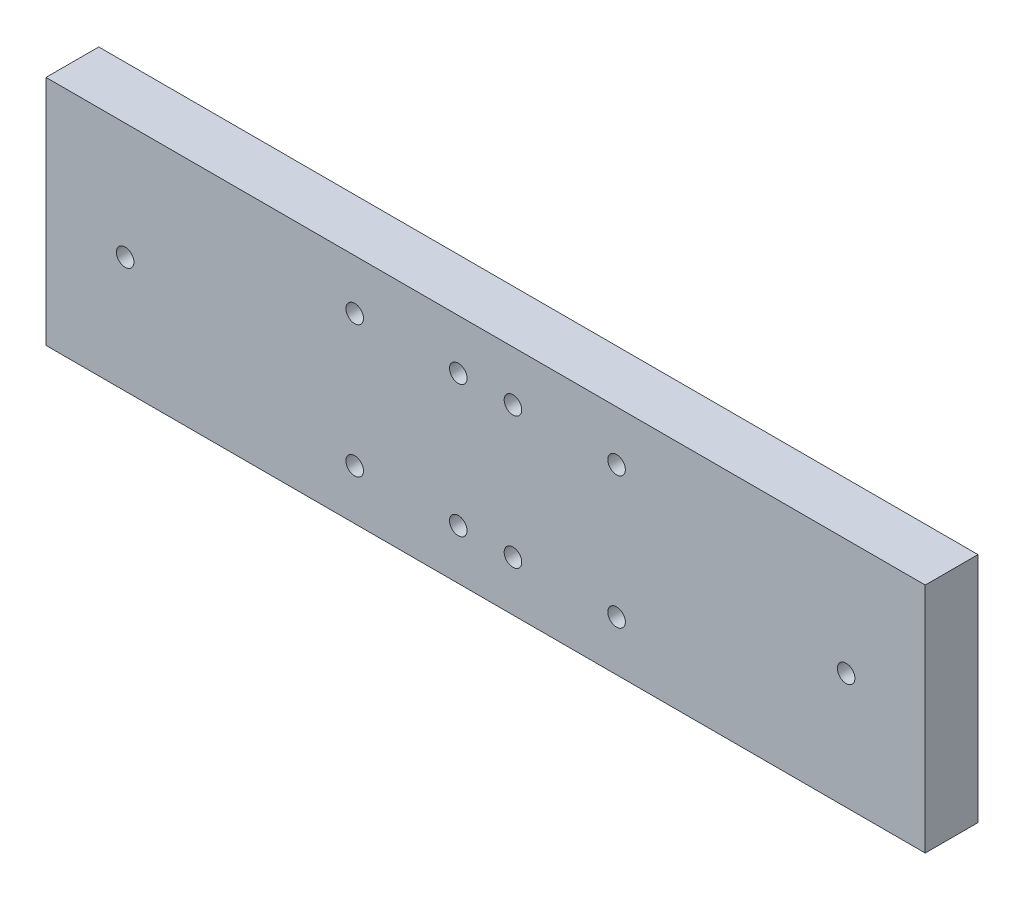
ISO-10303-21;
HEADER;
FILE_DESCRIPTION(('STEP AP214'),'2;1');
FILE_NAME('part.step','',(''),(''),'','','');
FILE_SCHEMA(('AUTOMOTIVE_DESIGN { 1 0 10303 214 1 1 1 1 }'));
ENDSEC;
DATA;
#1=APPLICATION_CONTEXT('core data for automotive mechanical design processes');
#2=APPLICATION_PROTOCOL_DEFINITION('international standard','automotive_design',2000,#1);
#3=PRODUCT_CONTEXT('',#1,'mechanical');
#4=PRODUCT('Part','Part','',(#3));
#5=PRODUCT_RELATED_PRODUCT_CATEGORY('part','',(#4));
#6=PRODUCT_DEFINITION_FORMATION('','',#4);
#7=PRODUCT_DEFINITION_CONTEXT('part definition',#1,'design');
#8=PRODUCT_DEFINITION('design','',#6,#7);
#9=PRODUCT_DEFINITION_SHAPE('','',#8);
#10=(LENGTH_UNIT() NAMED_UNIT(*) SI_UNIT(.MILLI.,.METRE.));
#11=(NAMED_UNIT(*) PLANE_ANGLE_UNIT() SI_UNIT($,.RADIAN.));
#12=(NAMED_UNIT(*) SI_UNIT($,.STERADIAN.) SOLID_ANGLE_UNIT());
#13=UNCERTAINTY_MEASURE_WITH_UNIT(LENGTH_MEASURE(1.E-05),#10,'distance_accuracy_value','');
#14=(GEOMETRIC_REPRESENTATION_CONTEXT(3) GLOBAL_UNCERTAINTY_ASSIGNED_CONTEXT((#13)) GLOBAL_UNIT_ASSIGNED_CONTEXT((#10,
#11,#12)) REPRESENTATION_CONTEXT('',''));
#15=CARTESIAN_POINT('',(0.,0.,0.));
#16=DIRECTION('',(0.,0.,1.));
#17=DIRECTION('',(1.,0.,0.));
#18=AXIS2_PLACEMENT_3D('',#15,#16,#17);
#19=CARTESIAN_POINT('',(0.,0.,15.));
#20=DIRECTION('',(0.,0.,-1.));
#21=DIRECTION('',(-1.,0.,0.));
#22=AXIS2_PLACEMENT_3D('',#19,#20,#21);
#23=PLANE('',#22);
#24=DIRECTION('',(0.,-1.,0.));
#25=VECTOR('',#24,1.);
#26=CARTESIAN_POINT('',(-147.500000000002,-5.74999999999681,15.));
#27=LINE('',#26,#25);
#28=CARTESIAN_POINT('',(-147.500000000002,-5.74999999999681,15.));
#29=VERTEX_POINT('',#28);
#30=CARTESIAN_POINT('',(-147.500000000002,-71.7499999999969,15.));
#31=VERTEX_POINT('',#30);
#32=EDGE_CURVE('E91',#29,#31,#27,.T.);
#33=ORIENTED_EDGE('',*,*,#32,.T.);
#34=DIRECTION('',(1.,0.,0.));
#35=VECTOR('',#34,1.);
#36=CARTESIAN_POINT('',(102.499999999998,-71.7499999999969,15.));
#37=LINE('',#36,#35);
#38=CARTESIAN_POINT('',(102.499999999998,-71.7499999999969,15.));
#39=VERTEX_POINT('',#38);
#40=EDGE_CURVE('E86',#31,#39,#37,.T.);
#41=ORIENTED_EDGE('',*,*,#40,.T.);
#42=DIRECTION('',(0.,1.,0.));
#43=VECTOR('',#42,1.);
#44=CARTESIAN_POINT('',(102.499999999998,-5.74999999999681,15.));
#45=LINE('',#44,#43);
#46=CARTESIAN_POINT('',(102.499999999998,-5.74999999999681,15.));
#47=VERTEX_POINT('',#46);
#48=EDGE_CURVE('E89',#39,#47,#45,.T.);
#49=ORIENTED_EDGE('',*,*,#48,.T.);
#50=DIRECTION('',(-1.,0.,0.));
#51=VECTOR('',#50,1.);
#52=CARTESIAN_POINT('',(102.499999999998,-5.74999999999681,15.));
#53=LINE('',#52,#51);
#54=EDGE_CURVE('E56',#47,#29,#53,.T.);
#55=ORIENTED_EDGE('',*,*,#54,.T.);
#56=EDGE_LOOP('',(#33,#41,#49,#55));
#57=FACE_BOUND('',#56,.T.);
#58=CARTESIAN_POINT('',(14.7286790709376,-19.9999999999967,15.));
#59=DIRECTION('',(0.,0.,1.));
#60=DIRECTION('',(1.,0.,0.));
#61=AXIS2_PLACEMENT_3D('',#58,#59,#60);
#62=CIRCLE('',#61,2.49999999999997);
#63=CARTESIAN_POINT('',(17.2286790709376,-19.9999999999967,15.));
#64=VERTEX_POINT('',#63);
#65=EDGE_CURVE('E106',#64,#64,#62,.T.);
#66=ORIENTED_EDGE('',*,*,#65,.F.);
#67=EDGE_LOOP('',(#66));
#68=FACE_BOUND('',#67,.T.);
#69=CARTESIAN_POINT('',(14.7286790709375,-57.4999999999968,15.));
#70=DIRECTION('',(0.,0.,1.));
#71=DIRECTION('',(1.,0.,0.));
#72=AXIS2_PLACEMENT_3D('',#69,#70,#71);
#73=CIRCLE('',#72,2.49999999999996);
#74=CARTESIAN_POINT('',(17.2286790709375,-57.4999999999968,15.));
#75=VERTEX_POINT('',#74);
#76=EDGE_CURVE('E121',#75,#75,#73,.T.);
#77=ORIENTED_EDGE('',*,*,#76,.F.);
#78=EDGE_LOOP('',(#77));
#79=FACE_BOUND('',#78,.T.);
#80=CARTESIAN_POINT('',(-14.728679070942,-57.4999999999966,15.));
#81=DIRECTION('',(0.,0.,1.));
#82=DIRECTION('',(1.,0.,0.));
#83=AXIS2_PLACEMENT_3D('',#80,#81,#82);
#84=CIRCLE('',#83,2.49999999999997);
#85=CARTESIAN_POINT('',(-12.228679070942,-57.4999999999966,15.));
#86=VERTEX_POINT('',#85);
#87=EDGE_CURVE('E127',#86,#86,#84,.T.);
#88=ORIENTED_EDGE('',*,*,#87,.F.);
#89=EDGE_LOOP('',(#88));
#90=FACE_BOUND('',#89,.T.);
#91=CARTESIAN_POINT('',(-14.7286790709419,-19.9999999999967,15.));
#92=DIRECTION('',(0.,0.,1.));
#93=DIRECTION('',(1.,0.,0.));
#94=AXIS2_PLACEMENT_3D('',#91,#92,#93);
#95=CIRCLE('',#94,2.49999999999997);
#96=CARTESIAN_POINT('',(-12.2286790709419,-19.9999999999967,15.));
#97=VERTEX_POINT('',#96);
#98=EDGE_CURVE('E133',#97,#97,#95,.T.);
#99=ORIENTED_EDGE('',*,*,#98,.F.);
#100=EDGE_LOOP('',(#99));
#101=FACE_BOUND('',#100,.T.);
#102=CARTESIAN_POINT('',(-30.2713209290622,-19.9999999999967,15.));
#103=DIRECTION('',(0.,0.,1.));
#104=DIRECTION('',(1.,0.,0.));
#105=AXIS2_PLACEMENT_3D('',#102,#103,#104);
#106=CIRCLE('',#105,2.49999999999997);
#107=CARTESIAN_POINT('',(-27.7713209290622,-19.9999999999967,15.));
#108=VERTEX_POINT('',#107);
#109=EDGE_CURVE('E139',#108,#108,#106,.T.);
#110=ORIENTED_EDGE('',*,*,#109,.F.);
#111=EDGE_LOOP('',(#110));
#112=FACE_BOUND('',#111,.T.);
#113=CARTESIAN_POINT('',(-30.2713209290623,-57.4999999999968,15.));
#114=DIRECTION('',(0.,0.,1.));
#115=DIRECTION('',(1.,0.,0.));
#116=AXIS2_PLACEMENT_3D('',#113,#114,#115);
#117=CIRCLE('',#116,2.49999999999997);
#118=CARTESIAN_POINT('',(-27.7713209290624,-57.4999999999968,15.));
#119=VERTEX_POINT('',#118);
#120=EDGE_CURVE('E145',#119,#119,#117,.T.);
#121=ORIENTED_EDGE('',*,*,#120,.F.);
#122=EDGE_LOOP('',(#121));
#123=FACE_BOUND('',#122,.T.);
#124=CARTESIAN_POINT('',(-59.7286790709419,-57.4999999999968,15.));
#125=DIRECTION('',(0.,0.,1.));
#126=DIRECTION('',(1.,0.,0.));
#127=AXIS2_PLACEMENT_3D('',#124,#125,#126);
#128=CIRCLE('',#127,2.49999999999997);
#129=CARTESIAN_POINT('',(-57.2286790709419,-57.4999999999968,15.));
#130=VERTEX_POINT('',#129);
#131=EDGE_CURVE('E151',#130,#130,#128,.T.);
#132=ORIENTED_EDGE('',*,*,#131,.F.);
#133=EDGE_LOOP('',(#132));
#134=FACE_BOUND('',#133,.T.);
#135=CARTESIAN_POINT('',(-59.7286790709417,-19.9999999999967,15.));
#136=DIRECTION('',(0.,0.,1.));
#137=DIRECTION('',(1.,0.,0.));
#138=AXIS2_PLACEMENT_3D('',#135,#136,#137);
#139=CIRCLE('',#138,2.49999999999997);
#140=CARTESIAN_POINT('',(-57.2286790709417,-19.9999999999967,15.));
#141=VERTEX_POINT('',#140);
#142=EDGE_CURVE('E157',#141,#141,#139,.T.);
#143=ORIENTED_EDGE('',*,*,#142,.F.);
#144=EDGE_LOOP('',(#143));
#145=FACE_BOUND('',#144,.T.);
#146=CARTESIAN_POINT('',(79.999999999998,-38.7499999999967,15.));
#147=DIRECTION('',(0.,0.,1.));
#148=DIRECTION('',(1.,0.,0.));
#149=AXIS2_PLACEMENT_3D('',#146,#147,#148);
#150=CIRCLE('',#149,2.50000000001049);
#151=CARTESIAN_POINT('',(82.5000000000085,-38.7499999999967,15.));
#152=VERTEX_POINT('',#151);
#153=EDGE_CURVE('E163',#152,#152,#150,.T.);
#154=ORIENTED_EDGE('',*,*,#153,.F.);
#155=EDGE_LOOP('',(#154));
#156=FACE_BOUND('',#155,.T.);
#157=CARTESIAN_POINT('',(-125.000000000002,-38.7499999999967,15.));
#158=DIRECTION('',(0.,0.,1.));
#159=DIRECTION('',(-1.,0.,0.));
#160=AXIS2_PLACEMENT_3D('',#157,#158,#159);
#161=CIRCLE('',#160,2.50000000001049);
#162=CARTESIAN_POINT('',(-127.500000000012,-38.7499999999967,15.));
#163=VERTEX_POINT('',#162);
#164=EDGE_CURVE('E169',#163,#163,#161,.T.);
#165=ORIENTED_EDGE('',*,*,#164,.F.);
#166=EDGE_LOOP('',(#165));
#167=FACE_BOUND('',#166,.T.);
#168=ADVANCED_FACE('F39',(#57,#68,#79,#90,#101,#112,#123,#134,#145,#156,#167),#23,.F.);
#169=CARTESIAN_POINT('',(0.,0.,0.));
#170=DIRECTION('',(0.,0.,-1.));
#171=DIRECTION('',(-1.,0.,0.));
#172=AXIS2_PLACEMENT_3D('',#169,#170,#171);
#173=PLANE('',#172);
#174=CARTESIAN_POINT('',(79.999999999998,-38.7499999999967,0.));
#175=DIRECTION('',(0.,0.,1.));
#176=DIRECTION('',(1.,0.,0.));
#177=AXIS2_PLACEMENT_3D('',#174,#175,#176);
#178=CIRCLE('',#177,2.50000000001049);
#179=CARTESIAN_POINT('',(82.5000000000085,-38.7499999999967,0.));
#180=VERTEX_POINT('',#179);
#181=EDGE_CURVE('E166',#180,#180,#178,.T.);
#182=ORIENTED_EDGE('',*,*,#181,.T.);
#183=EDGE_LOOP('',(#182));
#184=FACE_BOUND('',#183,.T.);
#185=CARTESIAN_POINT('',(-59.7286790709419,-57.4999999999968,0.));
#186=DIRECTION('',(0.,0.,1.));
#187=DIRECTION('',(1.,0.,0.));
#188=AXIS2_PLACEMENT_3D('',#185,#186,#187);
#189=CIRCLE('',#188,2.49999999999997);
#190=CARTESIAN_POINT('',(-57.2286790709419,-57.4999999999968,0.));
#191=VERTEX_POINT('',#190);
#192=EDGE_CURVE('E154',#191,#191,#189,.T.);
#193=ORIENTED_EDGE('',*,*,#192,.T.);
#194=EDGE_LOOP('',(#193));
#195=FACE_BOUND('',#194,.T.);
#196=CARTESIAN_POINT('',(-30.2713209290622,-19.9999999999967,0.));
#197=DIRECTION('',(0.,0.,1.));
#198=DIRECTION('',(1.,0.,0.));
#199=AXIS2_PLACEMENT_3D('',#196,#197,#198);
#200=CIRCLE('',#199,2.49999999999997);
#201=CARTESIAN_POINT('',(-27.7713209290622,-19.9999999999967,0.));
#202=VERTEX_POINT('',#201);
#203=EDGE_CURVE('E142',#202,#202,#200,.T.);
#204=ORIENTED_EDGE('',*,*,#203,.T.);
#205=EDGE_LOOP('',(#204));
#206=FACE_BOUND('',#205,.T.);
#207=CARTESIAN_POINT('',(-14.728679070942,-57.4999999999966,0.));
#208=DIRECTION('',(0.,0.,1.));
#209=DIRECTION('',(1.,0.,0.));
#210=AXIS2_PLACEMENT_3D('',#207,#208,#209);
#211=CIRCLE('',#210,2.49999999999997);
#212=CARTESIAN_POINT('',(-12.228679070942,-57.4999999999966,0.));
#213=VERTEX_POINT('',#212);
#214=EDGE_CURVE('E130',#213,#213,#211,.T.);
#215=ORIENTED_EDGE('',*,*,#214,.T.);
#216=EDGE_LOOP('',(#215));
#217=FACE_BOUND('',#216,.T.);
#218=CARTESIAN_POINT('',(14.7286790709376,-19.9999999999967,0.));
#219=DIRECTION('',(0.,0.,1.));
#220=DIRECTION('',(1.,0.,0.));
#221=AXIS2_PLACEMENT_3D('',#218,#219,#220);
#222=CIRCLE('',#221,2.49999999999997);
#223=CARTESIAN_POINT('',(17.2286790709376,-19.9999999999967,0.));
#224=VERTEX_POINT('',#223);
#225=EDGE_CURVE('E118',#224,#224,#222,.T.);
#226=ORIENTED_EDGE('',*,*,#225,.T.);
#227=EDGE_LOOP('',(#226));
#228=FACE_BOUND('',#227,.T.);
#229=DIRECTION('',(0.,-1.,0.));
#230=VECTOR('',#229,1.);
#231=CARTESIAN_POINT('',(-147.500000000002,-5.74999999999681,0.));
#232=LINE('',#231,#230);
#233=CARTESIAN_POINT('',(-147.500000000002,-5.74999999999681,0.));
#234=VERTEX_POINT('',#233);
#235=CARTESIAN_POINT('',(-147.500000000002,-71.7499999999969,0.));
#236=VERTEX_POINT('',#235);
#237=EDGE_CURVE('E103',#234,#236,#232,.T.);
#238=ORIENTED_EDGE('',*,*,#237,.F.);
#239=DIRECTION('',(-1.,0.,0.));
#240=VECTOR('',#239,1.);
#241=CARTESIAN_POINT('',(102.499999999998,-5.74999999999681,0.));
#242=LINE('',#241,#240);
#243=CARTESIAN_POINT('',(102.499999999998,-5.74999999999681,0.));
#244=VERTEX_POINT('',#243);
#245=EDGE_CURVE('E79',#244,#234,#242,.T.);
#246=ORIENTED_EDGE('',*,*,#245,.F.);
#247=DIRECTION('',(0.,1.,0.));
#248=VECTOR('',#247,1.);
#249=CARTESIAN_POINT('',(102.499999999998,-5.74999999999681,0.));
#250=LINE('',#249,#248);
#251=CARTESIAN_POINT('',(102.499999999998,-71.7499999999969,0.));
#252=VERTEX_POINT('',#251);
#253=EDGE_CURVE('E73',#252,#244,#250,.T.);
#254=ORIENTED_EDGE('',*,*,#253,.F.);
#255=DIRECTION('',(1.,0.,0.));
#256=VECTOR('',#255,1.);
#257=CARTESIAN_POINT('',(102.499999999998,-71.7499999999969,0.));
#258=LINE('',#257,#256);
#259=EDGE_CURVE('E95',#236,#252,#258,.T.);
#260=ORIENTED_EDGE('',*,*,#259,.F.);
#261=EDGE_LOOP('',(#238,#246,#254,#260));
#262=FACE_BOUND('',#261,.T.);
#263=CARTESIAN_POINT('',(14.7286790709375,-57.4999999999968,0.));
#264=DIRECTION('',(0.,0.,1.));
#265=DIRECTION('',(1.,0.,0.));
#266=AXIS2_PLACEMENT_3D('',#263,#264,#265);
#267=CIRCLE('',#266,2.49999999999996);
#268=CARTESIAN_POINT('',(17.2286790709375,-57.4999999999968,0.));
#269=VERTEX_POINT('',#268);
#270=EDGE_CURVE('E124',#269,#269,#267,.T.);
#271=ORIENTED_EDGE('',*,*,#270,.T.);
#272=EDGE_LOOP('',(#271));
#273=FACE_BOUND('',#272,.T.);
#274=CARTESIAN_POINT('',(-14.7286790709419,-19.9999999999967,0.));
#275=DIRECTION('',(0.,0.,1.));
#276=DIRECTION('',(1.,0.,0.));
#277=AXIS2_PLACEMENT_3D('',#274,#275,#276);
#278=CIRCLE('',#277,2.49999999999997);
#279=CARTESIAN_POINT('',(-12.2286790709419,-19.9999999999967,0.));
#280=VERTEX_POINT('',#279);
#281=EDGE_CURVE('E136',#280,#280,#278,.T.);
#282=ORIENTED_EDGE('',*,*,#281,.T.);
#283=EDGE_LOOP('',(#282));
#284=FACE_BOUND('',#283,.T.);
#285=CARTESIAN_POINT('',(-30.2713209290623,-57.4999999999968,0.));
#286=DIRECTION('',(0.,0.,1.));
#287=DIRECTION('',(1.,0.,0.));
#288=AXIS2_PLACEMENT_3D('',#285,#286,#287);
#289=CIRCLE('',#288,2.49999999999997);
#290=CARTESIAN_POINT('',(-27.7713209290624,-57.4999999999968,0.));
#291=VERTEX_POINT('',#290);
#292=EDGE_CURVE('E148',#291,#291,#289,.T.);
#293=ORIENTED_EDGE('',*,*,#292,.T.);
#294=EDGE_LOOP('',(#293));
#295=FACE_BOUND('',#294,.T.);
#296=CARTESIAN_POINT('',(-59.7286790709417,-19.9999999999967,0.));
#297=DIRECTION('',(0.,0.,1.));
#298=DIRECTION('',(1.,0.,0.));
#299=AXIS2_PLACEMENT_3D('',#296,#297,#298);
#300=CIRCLE('',#299,2.49999999999997);
#301=CARTESIAN_POINT('',(-57.2286790709417,-19.9999999999967,0.));
#302=VERTEX_POINT('',#301);
#303=EDGE_CURVE('E160',#302,#302,#300,.T.);
#304=ORIENTED_EDGE('',*,*,#303,.T.);
#305=EDGE_LOOP('',(#304));
#306=FACE_BOUND('',#305,.T.);
#307=CARTESIAN_POINT('',(-125.000000000002,-38.7499999999967,0.));
#308=DIRECTION('',(0.,0.,1.));
#309=DIRECTION('',(-1.,0.,0.));
#310=AXIS2_PLACEMENT_3D('',#307,#308,#309);
#311=CIRCLE('',#310,2.50000000001049);
#312=CARTESIAN_POINT('',(-127.500000000012,-38.7499999999967,0.));
#313=VERTEX_POINT('',#312);
#314=EDGE_CURVE('E172',#313,#313,#311,.T.);
#315=ORIENTED_EDGE('',*,*,#314,.T.);
#316=EDGE_LOOP('',(#315));
#317=FACE_BOUND('',#316,.T.);
#318=ADVANCED_FACE('F114',(#184,#195,#206,#217,#228,#262,#273,#284,#295,#306,#317),#173,.T.);
#319=CARTESIAN_POINT('',(-147.500000000002,-5.74999999999681,15.));
#320=DIRECTION('',(1.,0.,0.));
#321=DIRECTION('',(0.,1.,0.));
#322=AXIS2_PLACEMENT_3D('',#319,#320,#321);
#323=PLANE('',#322);
#324=ORIENTED_EDGE('',*,*,#237,.T.);
#325=DIRECTION('',(0.,0.,-1.));
#326=VECTOR('',#325,1.);
#327=CARTESIAN_POINT('',(-147.500000000002,-71.7499999999969,15.));
#328=LINE('',#327,#326);
#329=EDGE_CURVE('E11',#31,#236,#328,.T.);
#330=ORIENTED_EDGE('',*,*,#329,.F.);
#331=ORIENTED_EDGE('',*,*,#32,.F.);
#332=DIRECTION('',(0.,0.,-1.));
#333=VECTOR('',#332,1.);
#334=CARTESIAN_POINT('',(-147.500000000002,-5.74999999999681,15.));
#335=LINE('',#334,#333);
#336=EDGE_CURVE('E99',#29,#234,#335,.T.);
#337=ORIENTED_EDGE('',*,*,#336,.T.);
#338=EDGE_LOOP('',(#324,#330,#331,#337));
#339=FACE_BOUND('',#338,.T.);
#340=ADVANCED_FACE('F41',(#339),#323,.F.);
#341=CARTESIAN_POINT('',(102.499999999998,-71.7499999999969,15.));
#342=DIRECTION('',(0.,1.,0.));
#343=DIRECTION('',(0.,0.,1.));
#344=AXIS2_PLACEMENT_3D('',#341,#342,#343);
#345=PLANE('',#344);
#346=ORIENTED_EDGE('',*,*,#259,.T.);
#347=DIRECTION('',(0.,0.,-1.));
#348=VECTOR('',#347,1.);
#349=CARTESIAN_POINT('',(102.499999999998,-71.7499999999969,15.));
#350=LINE('',#349,#348);
#351=EDGE_CURVE('E48',#39,#252,#350,.T.);
#352=ORIENTED_EDGE('',*,*,#351,.F.);
#353=ORIENTED_EDGE('',*,*,#40,.F.);
#354=ORIENTED_EDGE('',*,*,#329,.T.);
#355=EDGE_LOOP('',(#346,#352,#353,#354));
#356=FACE_BOUND('',#355,.T.);
#357=ADVANCED_FACE('F94',(#356),#345,.F.);
#358=CARTESIAN_POINT('',(102.499999999998,-5.74999999999681,15.));
#359=DIRECTION('',(-1.,0.,0.));
#360=DIRECTION('',(0.,-1.,0.));
#361=AXIS2_PLACEMENT_3D('',#358,#359,#360);
#362=PLANE('',#361);
#363=ORIENTED_EDGE('',*,*,#253,.T.);
#364=DIRECTION('',(0.,0.,-1.));
#365=VECTOR('',#364,1.);
#366=CARTESIAN_POINT('',(102.499999999998,-5.74999999999681,15.));
#367=LINE('',#366,#365);
#368=EDGE_CURVE('E96',#47,#244,#367,.T.);
#369=ORIENTED_EDGE('',*,*,#368,.F.);
#370=ORIENTED_EDGE('',*,*,#48,.F.);
#371=ORIENTED_EDGE('',*,*,#351,.T.);
#372=EDGE_LOOP('',(#363,#369,#370,#371));
#373=FACE_BOUND('',#372,.T.);
#374=ADVANCED_FACE('F97',(#373),#362,.F.);
#375=CARTESIAN_POINT('',(102.499999999998,-5.74999999999681,15.));
#376=DIRECTION('',(0.,-1.,0.));
#377=DIRECTION('',(0.,0.,-1.));
#378=AXIS2_PLACEMENT_3D('',#375,#376,#377);
#379=PLANE('',#378);
#380=ORIENTED_EDGE('',*,*,#245,.T.);
#381=ORIENTED_EDGE('',*,*,#336,.F.);
#382=ORIENTED_EDGE('',*,*,#54,.F.);
#383=ORIENTED_EDGE('',*,*,#368,.T.);
#384=EDGE_LOOP('',(#380,#381,#382,#383));
#385=FACE_BOUND('',#384,.T.);
#386=ADVANCED_FACE('F111',(#385),#379,.F.);
#387=CARTESIAN_POINT('',(14.7286790709376,-19.9999999999967,15.));
#388=DIRECTION('',(0.,0.,-1.));
#389=DIRECTION('',(-1.,0.,0.));
#390=AXIS2_PLACEMENT_3D('',#387,#388,#389);
#391=CYLINDRICAL_SURFACE('',#390,2.49999999999997);
#392=ORIENTED_EDGE('',*,*,#65,.T.);
#393=EDGE_LOOP('',(#392));
#394=FACE_BOUND('',#393,.T.);
#395=ORIENTED_EDGE('',*,*,#225,.F.);
#396=EDGE_LOOP('',(#395));
#397=FACE_BOUND('',#396,.T.);
#398=ADVANCED_FACE('F189',(#394,#397),#391,.F.);
#399=CARTESIAN_POINT('',(14.7286790709375,-57.4999999999968,15.));
#400=DIRECTION('',(0.,0.,-1.));
#401=DIRECTION('',(-1.,0.,0.));
#402=AXIS2_PLACEMENT_3D('',#399,#400,#401);
#403=CYLINDRICAL_SURFACE('',#402,2.49999999999996);
#404=ORIENTED_EDGE('',*,*,#76,.T.);
#405=EDGE_LOOP('',(#404));
#406=FACE_BOUND('',#405,.T.);
#407=ORIENTED_EDGE('',*,*,#270,.F.);
#408=EDGE_LOOP('',(#407));
#409=FACE_BOUND('',#408,.T.);
#410=ADVANCED_FACE('F234',(#406,#409),#403,.F.);
#411=CARTESIAN_POINT('',(-14.728679070942,-57.4999999999966,15.));
#412=DIRECTION('',(0.,0.,-1.));
#413=DIRECTION('',(-1.,0.,0.));
#414=AXIS2_PLACEMENT_3D('',#411,#412,#413);
#415=CYLINDRICAL_SURFACE('',#414,2.49999999999997);
#416=ORIENTED_EDGE('',*,*,#87,.T.);
#417=EDGE_LOOP('',(#416));
#418=FACE_BOUND('',#417,.T.);
#419=ORIENTED_EDGE('',*,*,#214,.F.);
#420=EDGE_LOOP('',(#419));
#421=FACE_BOUND('',#420,.T.);
#422=ADVANCED_FACE('F242',(#418,#421),#415,.F.);
#423=CARTESIAN_POINT('',(-14.7286790709419,-19.9999999999967,15.));
#424=DIRECTION('',(0.,0.,-1.));
#425=DIRECTION('',(-1.,0.,0.));
#426=AXIS2_PLACEMENT_3D('',#423,#424,#425);
#427=CYLINDRICAL_SURFACE('',#426,2.49999999999997);
#428=ORIENTED_EDGE('',*,*,#98,.T.);
#429=EDGE_LOOP('',(#428));
#430=FACE_BOUND('',#429,.T.);
#431=ORIENTED_EDGE('',*,*,#281,.F.);
#432=EDGE_LOOP('',(#431));
#433=FACE_BOUND('',#432,.T.);
#434=ADVANCED_FACE('F250',(#430,#433),#427,.F.);
#435=CARTESIAN_POINT('',(-30.2713209290622,-19.9999999999967,15.));
#436=DIRECTION('',(0.,0.,-1.));
#437=DIRECTION('',(-1.,0.,0.));
#438=AXIS2_PLACEMENT_3D('',#435,#436,#437);
#439=CYLINDRICAL_SURFACE('',#438,2.49999999999997);
#440=ORIENTED_EDGE('',*,*,#109,.T.);
#441=EDGE_LOOP('',(#440));
#442=FACE_BOUND('',#441,.T.);
#443=ORIENTED_EDGE('',*,*,#203,.F.);
#444=EDGE_LOOP('',(#443));
#445=FACE_BOUND('',#444,.T.);
#446=ADVANCED_FACE('F259',(#442,#445),#439,.F.);
#447=CARTESIAN_POINT('',(-30.2713209290623,-57.4999999999968,15.));
#448=DIRECTION('',(0.,0.,-1.));
#449=DIRECTION('',(-1.,0.,0.));
#450=AXIS2_PLACEMENT_3D('',#447,#448,#449);
#451=CYLINDRICAL_SURFACE('',#450,2.49999999999997);
#452=ORIENTED_EDGE('',*,*,#120,.T.);
#453=EDGE_LOOP('',(#452));
#454=FACE_BOUND('',#453,.T.);
#455=ORIENTED_EDGE('',*,*,#292,.F.);
#456=EDGE_LOOP('',(#455));
#457=FACE_BOUND('',#456,.T.);
#458=ADVANCED_FACE('F268',(#454,#457),#451,.F.);
#459=CARTESIAN_POINT('',(-59.7286790709419,-57.4999999999968,15.));
#460=DIRECTION('',(0.,0.,-1.));
#461=DIRECTION('',(-1.,0.,0.));
#462=AXIS2_PLACEMENT_3D('',#459,#460,#461);
#463=CYLINDRICAL_SURFACE('',#462,2.49999999999997);
#464=ORIENTED_EDGE('',*,*,#131,.T.);
#465=EDGE_LOOP('',(#464));
#466=FACE_BOUND('',#465,.T.);
#467=ORIENTED_EDGE('',*,*,#192,.F.);
#468=EDGE_LOOP('',(#467));
#469=FACE_BOUND('',#468,.T.);
#470=ADVANCED_FACE('F277',(#466,#469),#463,.F.);
#471=CARTESIAN_POINT('',(-59.7286790709417,-19.9999999999967,15.));
#472=DIRECTION('',(0.,0.,-1.));
#473=DIRECTION('',(-1.,0.,0.));
#474=AXIS2_PLACEMENT_3D('',#471,#472,#473);
#475=CYLINDRICAL_SURFACE('',#474,2.49999999999997);
#476=ORIENTED_EDGE('',*,*,#142,.T.);
#477=EDGE_LOOP('',(#476));
#478=FACE_BOUND('',#477,.T.);
#479=ORIENTED_EDGE('',*,*,#303,.F.);
#480=EDGE_LOOP('',(#479));
#481=FACE_BOUND('',#480,.T.);
#482=ADVANCED_FACE('F286',(#478,#481),#475,.F.);
#483=CARTESIAN_POINT('',(79.999999999998,-38.7499999999967,15.));
#484=DIRECTION('',(0.,0.,-1.));
#485=DIRECTION('',(-1.,0.,0.));
#486=AXIS2_PLACEMENT_3D('',#483,#484,#485);
#487=CYLINDRICAL_SURFACE('',#486,2.50000000001049);
#488=ORIENTED_EDGE('',*,*,#153,.T.);
#489=EDGE_LOOP('',(#488));
#490=FACE_BOUND('',#489,.T.);
#491=ORIENTED_EDGE('',*,*,#181,.F.);
#492=EDGE_LOOP('',(#491));
#493=FACE_BOUND('',#492,.T.);
#494=ADVANCED_FACE('F295',(#490,#493),#487,.F.);
#495=CARTESIAN_POINT('',(-125.000000000002,-38.7499999999967,15.));
#496=DIRECTION('',(0.,0.,-1.));
#497=DIRECTION('',(-1.,0.,0.));
#498=AXIS2_PLACEMENT_3D('',#495,#496,#497);
#499=CYLINDRICAL_SURFACE('',#498,2.50000000001049);
#500=ORIENTED_EDGE('',*,*,#164,.T.);
#501=EDGE_LOOP('',(#500));
#502=FACE_BOUND('',#501,.T.);
#503=ORIENTED_EDGE('',*,*,#314,.F.);
#504=EDGE_LOOP('',(#503));
#505=FACE_BOUND('',#504,.T.);
#506=ADVANCED_FACE('F178',(#502,#505),#499,.F.);
#507=CLOSED_SHELL('',(#168,#318,#340,#357,#374,#386,#398,#410,#422,#434,#446,#458,#470,#482,
#494,#506));
#508=MANIFOLD_SOLID_BREP('B2',#507);
#509=ADVANCED_BREP_SHAPE_REPRESENTATION('',(#18,#508),#14);
#510=SHAPE_DEFINITION_REPRESENTATION(#9,#509);
ENDSEC;
END-ISO-10303-21;
